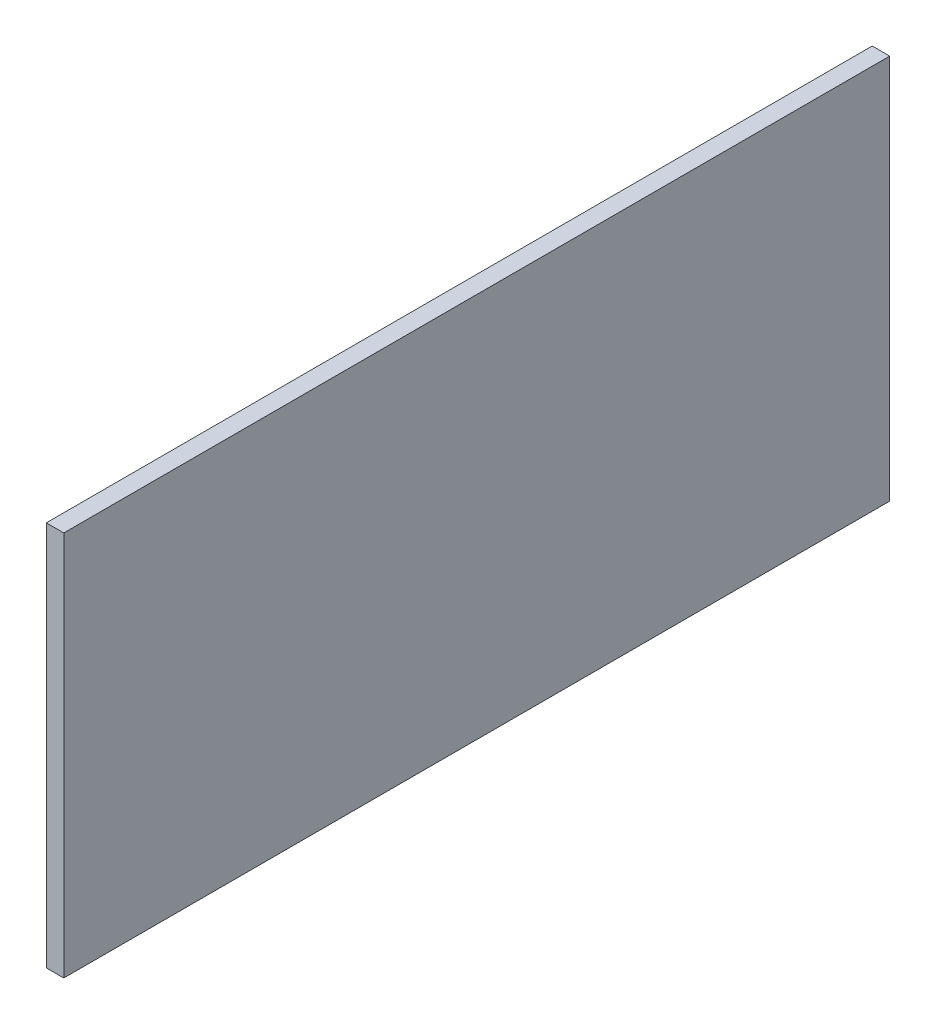
ISO-10303-21;
HEADER;
FILE_DESCRIPTION(('STEP AP214'),'2;1');
FILE_NAME('part.step','',(''),(''),'','','');
FILE_SCHEMA(('AUTOMOTIVE_DESIGN { 1 0 10303 214 1 1 1 1 }'));
ENDSEC;
DATA;
#1=APPLICATION_CONTEXT('core data for automotive mechanical design processes');
#2=APPLICATION_PROTOCOL_DEFINITION('international standard','automotive_design',2000,#1);
#3=PRODUCT_CONTEXT('',#1,'mechanical');
#4=PRODUCT('Part','Part','',(#3));
#5=PRODUCT_RELATED_PRODUCT_CATEGORY('part','',(#4));
#6=PRODUCT_DEFINITION_FORMATION('','',#4);
#7=PRODUCT_DEFINITION_CONTEXT('part definition',#1,'design');
#8=PRODUCT_DEFINITION('design','',#6,#7);
#9=PRODUCT_DEFINITION_SHAPE('','',#8);
#10=(LENGTH_UNIT() NAMED_UNIT(*) SI_UNIT(.MILLI.,.METRE.));
#11=(NAMED_UNIT(*) PLANE_ANGLE_UNIT() SI_UNIT($,.RADIAN.));
#12=(NAMED_UNIT(*) SI_UNIT($,.STERADIAN.) SOLID_ANGLE_UNIT());
#13=UNCERTAINTY_MEASURE_WITH_UNIT(LENGTH_MEASURE(1.E-05),#10,'distance_accuracy_value','');
#14=(GEOMETRIC_REPRESENTATION_CONTEXT(3) GLOBAL_UNCERTAINTY_ASSIGNED_CONTEXT((#13)) GLOBAL_UNIT_ASSIGNED_CONTEXT((#10,
#11,#12)) REPRESENTATION_CONTEXT('',''));
#15=CARTESIAN_POINT('',(0.,0.,0.));
#16=DIRECTION('',(0.,0.,1.));
#17=DIRECTION('',(1.,0.,0.));
#18=AXIS2_PLACEMENT_3D('',#15,#16,#17);
#19=CARTESIAN_POINT('',(3.175,0.,0.));
#20=DIRECTION('',(0.,0.,-1.));
#21=DIRECTION('',(-1.,0.,0.));
#22=AXIS2_PLACEMENT_3D('',#19,#20,#21);
#23=PLANE('',#22);
#24=DIRECTION('',(0.,-1.,0.));
#25=VECTOR('',#24,1.);
#26=CARTESIAN_POINT('',(0.,0.,0.));
#27=LINE('',#26,#25);
#28=CARTESIAN_POINT('',(0.,70.,0.));
#29=VERTEX_POINT('',#28);
#30=CARTESIAN_POINT('',(0.,0.,0.));
#31=VERTEX_POINT('',#30);
#32=EDGE_CURVE('E111',#29,#31,#27,.T.);
#33=ORIENTED_EDGE('',*,*,#32,.T.);
#34=DIRECTION('',(-1.,0.,0.));
#35=VECTOR('',#34,1.);
#36=CARTESIAN_POINT('',(3.175,0.,0.));
#37=LINE('',#36,#35);
#38=CARTESIAN_POINT('',(3.175,0.,0.));
#39=VERTEX_POINT('',#38);
#40=EDGE_CURVE('E11',#39,#31,#37,.T.);
#41=ORIENTED_EDGE('',*,*,#40,.F.);
#42=DIRECTION('',(0.,-1.,0.));
#43=VECTOR('',#42,1.);
#44=CARTESIAN_POINT('',(3.175,0.,0.));
#45=LINE('',#44,#43);
#46=CARTESIAN_POINT('',(3.175,70.,0.));
#47=VERTEX_POINT('',#46);
#48=EDGE_CURVE('E95',#47,#39,#45,.T.);
#49=ORIENTED_EDGE('',*,*,#48,.F.);
#50=DIRECTION('',(-1.,0.,0.));
#51=VECTOR('',#50,1.);
#52=CARTESIAN_POINT('',(3.175,70.,0.));
#53=LINE('',#52,#51);
#54=EDGE_CURVE('E107',#47,#29,#53,.T.);
#55=ORIENTED_EDGE('',*,*,#54,.T.);
#56=EDGE_LOOP('',(#33,#41,#49,#55));
#57=FACE_BOUND('',#56,.T.);
#58=ADVANCED_FACE('F43',(#57),#23,.F.);
#59=CARTESIAN_POINT('',(3.175,0.,0.));
#60=DIRECTION('',(0.,1.,0.));
#61=DIRECTION('',(0.,0.,1.));
#62=AXIS2_PLACEMENT_3D('',#59,#60,#61);
#63=PLANE('',#62);
#64=DIRECTION('',(0.,0.,-1.));
#65=VECTOR('',#64,1.);
#66=CARTESIAN_POINT('',(0.,0.,0.));
#67=LINE('',#66,#65);
#68=CARTESIAN_POINT('',(0.,0.,-150.));
#69=VERTEX_POINT('',#68);
#70=EDGE_CURVE('E100',#31,#69,#67,.T.);
#71=ORIENTED_EDGE('',*,*,#70,.T.);
#72=DIRECTION('',(-1.,0.,0.));
#73=VECTOR('',#72,1.);
#74=CARTESIAN_POINT('',(3.175,0.,-150.));
#75=LINE('',#74,#73);
#76=CARTESIAN_POINT('',(3.175,0.,-150.));
#77=VERTEX_POINT('',#76);
#78=EDGE_CURVE('E52',#77,#69,#75,.T.);
#79=ORIENTED_EDGE('',*,*,#78,.F.);
#80=DIRECTION('',(0.,0.,-1.));
#81=VECTOR('',#80,1.);
#82=CARTESIAN_POINT('',(3.175,0.,0.));
#83=LINE('',#82,#81);
#84=EDGE_CURVE('E90',#39,#77,#83,.T.);
#85=ORIENTED_EDGE('',*,*,#84,.F.);
#86=ORIENTED_EDGE('',*,*,#40,.T.);
#87=EDGE_LOOP('',(#71,#79,#85,#86));
#88=FACE_BOUND('',#87,.T.);
#89=ADVANCED_FACE('F99',(#88),#63,.F.);
#90=CARTESIAN_POINT('',(3.175,0.,-150.));
#91=DIRECTION('',(0.,0.,1.));
#92=DIRECTION('',(1.,0.,0.));
#93=AXIS2_PLACEMENT_3D('',#90,#91,#92);
#94=PLANE('',#93);
#95=DIRECTION('',(0.,1.,0.));
#96=VECTOR('',#95,1.);
#97=CARTESIAN_POINT('',(0.,0.,-150.));
#98=LINE('',#97,#96);
#99=CARTESIAN_POINT('',(0.,70.,-150.));
#100=VERTEX_POINT('',#99);
#101=EDGE_CURVE('E77',#69,#100,#98,.T.);
#102=ORIENTED_EDGE('',*,*,#101,.T.);
#103=DIRECTION('',(-1.,0.,0.));
#104=VECTOR('',#103,1.);
#105=CARTESIAN_POINT('',(3.175,70.,-150.));
#106=LINE('',#105,#104);
#107=CARTESIAN_POINT('',(3.175,70.,-150.));
#108=VERTEX_POINT('',#107);
#109=EDGE_CURVE('E102',#108,#100,#106,.T.);
#110=ORIENTED_EDGE('',*,*,#109,.F.);
#111=DIRECTION('',(0.,1.,0.));
#112=VECTOR('',#111,1.);
#113=CARTESIAN_POINT('',(3.175,0.,-150.));
#114=LINE('',#113,#112);
#115=EDGE_CURVE('E93',#77,#108,#114,.T.);
#116=ORIENTED_EDGE('',*,*,#115,.F.);
#117=ORIENTED_EDGE('',*,*,#78,.T.);
#118=EDGE_LOOP('',(#102,#110,#116,#117));
#119=FACE_BOUND('',#118,.T.);
#120=ADVANCED_FACE('F103',(#119),#94,.F.);
#121=CARTESIAN_POINT('',(3.175,70.,0.));
#122=DIRECTION('',(0.,-1.,0.));
#123=DIRECTION('',(0.,0.,-1.));
#124=AXIS2_PLACEMENT_3D('',#121,#122,#123);
#125=PLANE('',#124);
#126=DIRECTION('',(0.,0.,1.));
#127=VECTOR('',#126,1.);
#128=CARTESIAN_POINT('',(0.,70.,0.));
#129=LINE('',#128,#127);
#130=EDGE_CURVE('E83',#100,#29,#129,.T.);
#131=ORIENTED_EDGE('',*,*,#130,.T.);
#132=ORIENTED_EDGE('',*,*,#54,.F.);
#133=DIRECTION('',(0.,0.,1.));
#134=VECTOR('',#133,1.);
#135=CARTESIAN_POINT('',(3.175,70.,0.));
#136=LINE('',#135,#134);
#137=EDGE_CURVE('E60',#108,#47,#136,.T.);
#138=ORIENTED_EDGE('',*,*,#137,.F.);
#139=ORIENTED_EDGE('',*,*,#109,.T.);
#140=EDGE_LOOP('',(#131,#132,#138,#139));
#141=FACE_BOUND('',#140,.T.);
#142=ADVANCED_FACE('F124',(#141),#125,.F.);
#143=CARTESIAN_POINT('',(3.175,0.,0.));
#144=DIRECTION('',(-1.,0.,0.));
#145=DIRECTION('',(0.,0.,1.));
#146=AXIS2_PLACEMENT_3D('',#143,#144,#145);
#147=PLANE('',#146);
#148=ORIENTED_EDGE('',*,*,#48,.T.);
#149=ORIENTED_EDGE('',*,*,#84,.T.);
#150=ORIENTED_EDGE('',*,*,#115,.T.);
#151=ORIENTED_EDGE('',*,*,#137,.T.);
#152=EDGE_LOOP('',(#148,#149,#150,#151));
#153=FACE_BOUND('',#152,.T.);
#154=ADVANCED_FACE('F91',(#153),#147,.F.);
#155=CARTESIAN_POINT('',(0.,0.,0.));
#156=DIRECTION('',(-1.,0.,0.));
#157=DIRECTION('',(0.,0.,1.));
#158=AXIS2_PLACEMENT_3D('',#155,#156,#157);
#159=PLANE('',#158);
#160=ORIENTED_EDGE('',*,*,#32,.F.);
#161=ORIENTED_EDGE('',*,*,#130,.F.);
#162=ORIENTED_EDGE('',*,*,#101,.F.);
#163=ORIENTED_EDGE('',*,*,#70,.F.);
#164=EDGE_LOOP('',(#160,#161,#162,#163));
#165=FACE_BOUND('',#164,.T.);
#166=ADVANCED_FACE('F127',(#165),#159,.T.);
#167=CLOSED_SHELL('',(#58,#89,#120,#142,#154,#166));
#168=MANIFOLD_SOLID_BREP('B2',#167);
#169=ADVANCED_BREP_SHAPE_REPRESENTATION('',(#18,#168),#14);
#170=SHAPE_DEFINITION_REPRESENTATION(#9,#169);
ENDSEC;
END-ISO-10303-21;
